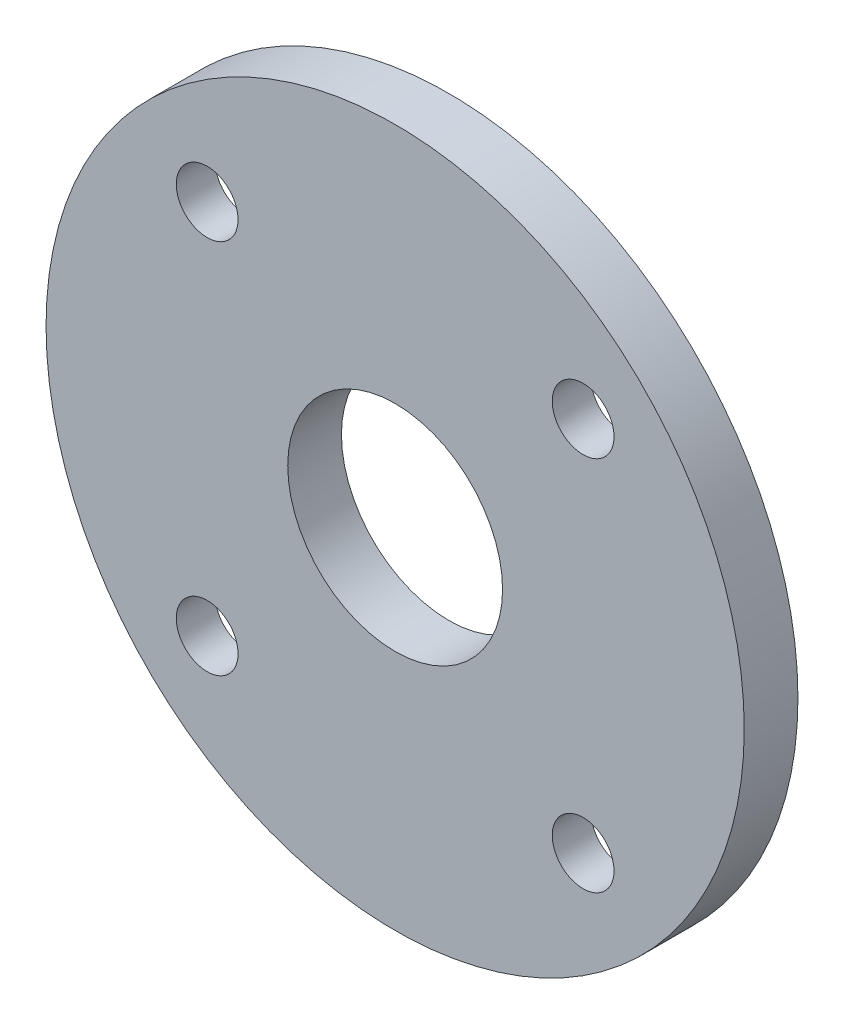
ISO-10303-21;
HEADER;
FILE_DESCRIPTION(('STEP AP214'),'2;1');
FILE_NAME('part.step','',(''),(''),'','','');
FILE_SCHEMA(('AUTOMOTIVE_DESIGN { 1 0 10303 214 1 1 1 1 }'));
ENDSEC;
DATA;
#1=APPLICATION_CONTEXT('core data for automotive mechanical design processes');
#2=APPLICATION_PROTOCOL_DEFINITION('international standard','automotive_design',2000,#1);
#3=PRODUCT_CONTEXT('',#1,'mechanical');
#4=PRODUCT('Part','Part','',(#3));
#5=PRODUCT_RELATED_PRODUCT_CATEGORY('part','',(#4));
#6=PRODUCT_DEFINITION_FORMATION('','',#4);
#7=PRODUCT_DEFINITION_CONTEXT('part definition',#1,'design');
#8=PRODUCT_DEFINITION('design','',#6,#7);
#9=PRODUCT_DEFINITION_SHAPE('','',#8);
#10=(LENGTH_UNIT() NAMED_UNIT(*) SI_UNIT(.MILLI.,.METRE.));
#11=(NAMED_UNIT(*) PLANE_ANGLE_UNIT() SI_UNIT($,.RADIAN.));
#12=(NAMED_UNIT(*) SI_UNIT($,.STERADIAN.) SOLID_ANGLE_UNIT());
#13=UNCERTAINTY_MEASURE_WITH_UNIT(LENGTH_MEASURE(1.E-05),#10,'distance_accuracy_value','');
#14=(GEOMETRIC_REPRESENTATION_CONTEXT(3) GLOBAL_UNCERTAINTY_ASSIGNED_CONTEXT((#13)) GLOBAL_UNIT_ASSIGNED_CONTEXT((#10,
#11,#12)) REPRESENTATION_CONTEXT('',''));
#15=CARTESIAN_POINT('',(0.,0.,0.));
#16=DIRECTION('',(0.,0.,1.));
#17=DIRECTION('',(1.,0.,0.));
#18=AXIS2_PLACEMENT_3D('',#15,#16,#17);
#19=CARTESIAN_POINT('',(0.,0.,2.));
#20=DIRECTION('',(0.,0.,1.));
#21=DIRECTION('',(1.,0.,0.));
#22=AXIS2_PLACEMENT_3D('',#19,#20,#21);
#23=PLANE('',#22);
#24=CARTESIAN_POINT('',(7.,-7.,2.));
#25=DIRECTION('',(0.,0.,1.));
#26=DIRECTION('',(1.,0.,0.));
#27=AXIS2_PLACEMENT_3D('',#24,#25,#26);
#28=CIRCLE('',#27,1.15);
#29=CARTESIAN_POINT('',(8.15,-7.,2.));
#30=VERTEX_POINT('',#29);
#31=EDGE_CURVE('E70',#30,#30,#28,.T.);
#32=ORIENTED_EDGE('',*,*,#31,.F.);
#33=EDGE_LOOP('',(#32));
#34=FACE_BOUND('',#33,.T.);
#35=CARTESIAN_POINT('',(-7.,-7.,2.));
#36=DIRECTION('',(0.,0.,1.));
#37=DIRECTION('',(1.,0.,0.));
#38=AXIS2_PLACEMENT_3D('',#35,#36,#37);
#39=CIRCLE('',#38,1.15);
#40=CARTESIAN_POINT('',(-5.85,-7.,2.));
#41=VERTEX_POINT('',#40);
#42=EDGE_CURVE('E73',#41,#41,#39,.T.);
#43=ORIENTED_EDGE('',*,*,#42,.F.);
#44=EDGE_LOOP('',(#43));
#45=FACE_BOUND('',#44,.T.);
#46=CARTESIAN_POINT('',(-7.,7.,2.));
#47=DIRECTION('',(0.,0.,1.));
#48=DIRECTION('',(1.,0.,0.));
#49=AXIS2_PLACEMENT_3D('',#46,#47,#48);
#50=CIRCLE('',#49,1.15);
#51=CARTESIAN_POINT('',(-5.85,7.,2.));
#52=VERTEX_POINT('',#51);
#53=EDGE_CURVE('E77',#52,#52,#50,.T.);
#54=ORIENTED_EDGE('',*,*,#53,.F.);
#55=EDGE_LOOP('',(#54));
#56=FACE_BOUND('',#55,.T.);
#57=CARTESIAN_POINT('',(7.,7.,2.));
#58=DIRECTION('',(0.,0.,1.));
#59=DIRECTION('',(1.,0.,0.));
#60=AXIS2_PLACEMENT_3D('',#57,#58,#59);
#61=CIRCLE('',#60,1.15);
#62=CARTESIAN_POINT('',(8.15,7.,2.));
#63=VERTEX_POINT('',#62);
#64=EDGE_CURVE('E78',#63,#63,#61,.T.);
#65=ORIENTED_EDGE('',*,*,#64,.F.);
#66=EDGE_LOOP('',(#65));
#67=FACE_BOUND('',#66,.T.);
#68=CARTESIAN_POINT('',(0.,0.,2.));
#69=DIRECTION('',(0.,0.,1.));
#70=DIRECTION('',(1.,0.,0.));
#71=AXIS2_PLACEMENT_3D('',#68,#69,#70);
#72=CIRCLE('',#71,13.);
#73=CARTESIAN_POINT('',(13.,0.,2.));
#74=VERTEX_POINT('',#73);
#75=EDGE_CURVE('E10',#74,#74,#72,.T.);
#76=ORIENTED_EDGE('',*,*,#75,.T.);
#77=EDGE_LOOP('',(#76));
#78=FACE_BOUND('',#77,.T.);
#79=CARTESIAN_POINT('',(0.,0.,2.));
#80=DIRECTION('',(0.,0.,1.));
#81=DIRECTION('',(1.,0.,0.));
#82=AXIS2_PLACEMENT_3D('',#79,#80,#81);
#83=CIRCLE('',#82,4.);
#84=CARTESIAN_POINT('',(4.,0.,2.));
#85=VERTEX_POINT('',#84);
#86=EDGE_CURVE('E49',#85,#85,#83,.T.);
#87=ORIENTED_EDGE('',*,*,#86,.F.);
#88=EDGE_LOOP('',(#87));
#89=FACE_BOUND('',#88,.T.);
#90=ADVANCED_FACE('F40',(#34,#45,#56,#67,#78,#89),#23,.T.);
#91=CARTESIAN_POINT('',(0.,0.,0.));
#92=DIRECTION('',(0.,0.,1.));
#93=DIRECTION('',(1.,0.,0.));
#94=AXIS2_PLACEMENT_3D('',#91,#92,#93);
#95=PLANE('',#94);
#96=CARTESIAN_POINT('',(7.,-7.,0.));
#97=DIRECTION('',(0.,0.,1.));
#98=DIRECTION('',(1.,0.,0.));
#99=AXIS2_PLACEMENT_3D('',#96,#97,#98);
#100=CIRCLE('',#99,2.1);
#101=CARTESIAN_POINT('',(9.1,-7.,0.));
#102=VERTEX_POINT('',#101);
#103=EDGE_CURVE('E126',#102,#102,#100,.T.);
#104=ORIENTED_EDGE('',*,*,#103,.T.);
#105=EDGE_LOOP('',(#104));
#106=FACE_BOUND('',#105,.T.);
#107=CARTESIAN_POINT('',(-7.,-7.,0.));
#108=DIRECTION('',(0.,0.,1.));
#109=DIRECTION('',(1.,0.,0.));
#110=AXIS2_PLACEMENT_3D('',#107,#108,#109);
#111=CIRCLE('',#110,2.1);
#112=CARTESIAN_POINT('',(-4.9,-7.,0.));
#113=VERTEX_POINT('',#112);
#114=EDGE_CURVE('E131',#113,#113,#111,.T.);
#115=ORIENTED_EDGE('',*,*,#114,.T.);
#116=EDGE_LOOP('',(#115));
#117=FACE_BOUND('',#116,.T.);
#118=CARTESIAN_POINT('',(-7.,7.,0.));
#119=DIRECTION('',(0.,0.,1.));
#120=DIRECTION('',(1.,0.,0.));
#121=AXIS2_PLACEMENT_3D('',#118,#119,#120);
#122=CIRCLE('',#121,2.1);
#123=CARTESIAN_POINT('',(-4.9,7.,0.));
#124=VERTEX_POINT('',#123);
#125=EDGE_CURVE('E124',#124,#124,#122,.T.);
#126=ORIENTED_EDGE('',*,*,#125,.T.);
#127=EDGE_LOOP('',(#126));
#128=FACE_BOUND('',#127,.T.);
#129=CARTESIAN_POINT('',(7.,7.,0.));
#130=DIRECTION('',(0.,0.,1.));
#131=DIRECTION('',(1.,0.,0.));
#132=AXIS2_PLACEMENT_3D('',#129,#130,#131);
#133=CIRCLE('',#132,2.1);
#134=CARTESIAN_POINT('',(9.1,7.,0.));
#135=VERTEX_POINT('',#134);
#136=EDGE_CURVE('E119',#135,#135,#133,.T.);
#137=ORIENTED_EDGE('',*,*,#136,.T.);
#138=EDGE_LOOP('',(#137));
#139=FACE_BOUND('',#138,.T.);
#140=CARTESIAN_POINT('',(0.,0.,0.));
#141=DIRECTION('',(0.,0.,1.));
#142=DIRECTION('',(1.,0.,0.));
#143=AXIS2_PLACEMENT_3D('',#140,#141,#142);
#144=CIRCLE('',#143,13.);
#145=CARTESIAN_POINT('',(13.,0.,0.));
#146=VERTEX_POINT('',#145);
#147=EDGE_CURVE('E44',#146,#146,#144,.T.);
#148=ORIENTED_EDGE('',*,*,#147,.F.);
#149=EDGE_LOOP('',(#148));
#150=FACE_BOUND('',#149,.T.);
#151=CARTESIAN_POINT('',(0.,0.,0.));
#152=DIRECTION('',(0.,0.,1.));
#153=DIRECTION('',(1.,0.,0.));
#154=AXIS2_PLACEMENT_3D('',#151,#152,#153);
#155=CIRCLE('',#154,4.);
#156=CARTESIAN_POINT('',(4.,0.,0.));
#157=VERTEX_POINT('',#156);
#158=EDGE_CURVE('E52',#157,#157,#155,.T.);
#159=ORIENTED_EDGE('',*,*,#158,.T.);
#160=EDGE_LOOP('',(#159));
#161=FACE_BOUND('',#160,.T.);
#162=ADVANCED_FACE('F88',(#106,#117,#128,#139,#150,#161),#95,.F.);
#163=CARTESIAN_POINT('',(0.,0.,2.));
#164=DIRECTION('',(0.,0.,-1.));
#165=DIRECTION('',(-1.,0.,0.));
#166=AXIS2_PLACEMENT_3D('',#163,#164,#165);
#167=CYLINDRICAL_SURFACE('',#166,13.);
#168=ORIENTED_EDGE('',*,*,#75,.F.);
#169=EDGE_LOOP('',(#168));
#170=FACE_BOUND('',#169,.T.);
#171=ORIENTED_EDGE('',*,*,#147,.T.);
#172=EDGE_LOOP('',(#171));
#173=FACE_BOUND('',#172,.T.);
#174=ADVANCED_FACE('F39',(#170,#173),#167,.T.);
#175=CARTESIAN_POINT('',(0.,0.,2.));
#176=DIRECTION('',(0.,0.,-1.));
#177=DIRECTION('',(-1.,0.,0.));
#178=AXIS2_PLACEMENT_3D('',#175,#176,#177);
#179=CYLINDRICAL_SURFACE('',#178,4.);
#180=ORIENTED_EDGE('',*,*,#86,.T.);
#181=EDGE_LOOP('',(#180));
#182=FACE_BOUND('',#181,.T.);
#183=ORIENTED_EDGE('',*,*,#158,.F.);
#184=EDGE_LOOP('',(#183));
#185=FACE_BOUND('',#184,.T.);
#186=ADVANCED_FACE('F86',(#182,#185),#179,.F.);
#187=CARTESIAN_POINT('',(7.,7.,2.));
#188=DIRECTION('',(0.,0.,-1.));
#189=DIRECTION('',(-1.,0.,0.));
#190=AXIS2_PLACEMENT_3D('',#187,#188,#189);
#191=CYLINDRICAL_SURFACE('',#190,1.15);
#192=CARTESIAN_POINT('',(7.,7.,0.55));
#193=DIRECTION('',(0.,0.,1.));
#194=DIRECTION('',(1.,0.,0.));
#195=AXIS2_PLACEMENT_3D('',#192,#193,#194);
#196=CIRCLE('',#195,1.15);
#197=CARTESIAN_POINT('',(8.15,7.,0.55));
#198=VERTEX_POINT('',#197);
#199=EDGE_CURVE('E41',#198,#198,#196,.T.);
#200=ORIENTED_EDGE('',*,*,#199,.F.);
#201=EDGE_LOOP('',(#200));
#202=FACE_BOUND('',#201,.T.);
#203=ORIENTED_EDGE('',*,*,#64,.T.);
#204=EDGE_LOOP('',(#203));
#205=FACE_BOUND('',#204,.T.);
#206=ADVANCED_FACE('F95',(#202,#205),#191,.F.);
#207=CARTESIAN_POINT('',(-7.,7.,2.));
#208=DIRECTION('',(0.,0.,-1.));
#209=DIRECTION('',(-1.,0.,0.));
#210=AXIS2_PLACEMENT_3D('',#207,#208,#209);
#211=CYLINDRICAL_SURFACE('',#210,1.15);
#212=CARTESIAN_POINT('',(-7.,7.,0.55));
#213=DIRECTION('',(0.,0.,1.));
#214=DIRECTION('',(1.,0.,0.));
#215=AXIS2_PLACEMENT_3D('',#212,#213,#214);
#216=CIRCLE('',#215,1.15);
#217=CARTESIAN_POINT('',(-5.85,7.,0.55));
#218=VERTEX_POINT('',#217);
#219=EDGE_CURVE('E65',#218,#218,#216,.T.);
#220=ORIENTED_EDGE('',*,*,#219,.F.);
#221=EDGE_LOOP('',(#220));
#222=FACE_BOUND('',#221,.T.);
#223=ORIENTED_EDGE('',*,*,#53,.T.);
#224=EDGE_LOOP('',(#223));
#225=FACE_BOUND('',#224,.T.);
#226=ADVANCED_FACE('F100',(#222,#225),#211,.F.);
#227=CARTESIAN_POINT('',(-7.,-7.,2.));
#228=DIRECTION('',(0.,0.,-1.));
#229=DIRECTION('',(-1.,0.,0.));
#230=AXIS2_PLACEMENT_3D('',#227,#228,#229);
#231=CYLINDRICAL_SURFACE('',#230,1.15);
#232=CARTESIAN_POINT('',(-7.,-7.,0.55));
#233=DIRECTION('',(0.,0.,1.));
#234=DIRECTION('',(1.,0.,0.));
#235=AXIS2_PLACEMENT_3D('',#232,#233,#234);
#236=CIRCLE('',#235,1.15);
#237=CARTESIAN_POINT('',(-5.85,-7.,0.55));
#238=VERTEX_POINT('',#237);
#239=EDGE_CURVE('E56',#238,#238,#236,.T.);
#240=ORIENTED_EDGE('',*,*,#239,.F.);
#241=EDGE_LOOP('',(#240));
#242=FACE_BOUND('',#241,.T.);
#243=ORIENTED_EDGE('',*,*,#42,.T.);
#244=EDGE_LOOP('',(#243));
#245=FACE_BOUND('',#244,.T.);
#246=ADVANCED_FACE('F185',(#242,#245),#231,.F.);
#247=CARTESIAN_POINT('',(7.,-7.,2.));
#248=DIRECTION('',(0.,0.,-1.));
#249=DIRECTION('',(-1.,0.,0.));
#250=AXIS2_PLACEMENT_3D('',#247,#248,#249);
#251=CYLINDRICAL_SURFACE('',#250,1.15);
#252=CARTESIAN_POINT('',(7.,-7.,0.55));
#253=DIRECTION('',(0.,0.,1.));
#254=DIRECTION('',(1.,0.,0.));
#255=AXIS2_PLACEMENT_3D('',#252,#253,#254);
#256=CIRCLE('',#255,1.15);
#257=CARTESIAN_POINT('',(8.15,-7.,0.55));
#258=VERTEX_POINT('',#257);
#259=EDGE_CURVE('E57',#258,#258,#256,.T.);
#260=ORIENTED_EDGE('',*,*,#259,.F.);
#261=EDGE_LOOP('',(#260));
#262=FACE_BOUND('',#261,.T.);
#263=ORIENTED_EDGE('',*,*,#31,.T.);
#264=EDGE_LOOP('',(#263));
#265=FACE_BOUND('',#264,.T.);
#266=ADVANCED_FACE('F169',(#262,#265),#251,.F.);
#267=CARTESIAN_POINT('',(7.,-7.,0.55));
#268=DIRECTION('',(0.,0.,-1.));
#269=DIRECTION('',(-1.,0.,0.));
#270=AXIS2_PLACEMENT_3D('',#267,#268,#269);
#271=CYLINDRICAL_SURFACE('',#270,2.1);
#272=CARTESIAN_POINT('',(7.,-7.,0.55));
#273=DIRECTION('',(0.,0.,1.));
#274=DIRECTION('',(1.,0.,0.));
#275=AXIS2_PLACEMENT_3D('',#272,#273,#274);
#276=CIRCLE('',#275,2.1);
#277=CARTESIAN_POINT('',(9.1,-7.,0.55));
#278=VERTEX_POINT('',#277);
#279=EDGE_CURVE('E127',#278,#278,#276,.T.);
#280=ORIENTED_EDGE('',*,*,#279,.T.);
#281=EDGE_LOOP('',(#280));
#282=FACE_BOUND('',#281,.T.);
#283=ORIENTED_EDGE('',*,*,#103,.F.);
#284=EDGE_LOOP('',(#283));
#285=FACE_BOUND('',#284,.T.);
#286=ADVANCED_FACE('F168',(#282,#285),#271,.F.);
#287=CARTESIAN_POINT('',(7.,-7.,0.55));
#288=DIRECTION('',(0.,0.,1.));
#289=DIRECTION('',(1.,0.,0.));
#290=AXIS2_PLACEMENT_3D('',#287,#288,#289);
#291=PLANE('',#290);
#292=ORIENTED_EDGE('',*,*,#259,.T.);
#293=EDGE_LOOP('',(#292));
#294=FACE_BOUND('',#293,.T.);
#295=ORIENTED_EDGE('',*,*,#279,.F.);
#296=EDGE_LOOP('',(#295));
#297=FACE_BOUND('',#296,.T.);
#298=ADVANCED_FACE('F161',(#294,#297),#291,.F.);
#299=CARTESIAN_POINT('',(-7.,-7.,0.55));
#300=DIRECTION('',(0.,0.,-1.));
#301=DIRECTION('',(-1.,0.,0.));
#302=AXIS2_PLACEMENT_3D('',#299,#300,#301);
#303=CYLINDRICAL_SURFACE('',#302,2.1);
#304=CARTESIAN_POINT('',(-7.,-7.,0.55));
#305=DIRECTION('',(0.,0.,1.));
#306=DIRECTION('',(1.,0.,0.));
#307=AXIS2_PLACEMENT_3D('',#304,#305,#306);
#308=CIRCLE('',#307,2.1);
#309=CARTESIAN_POINT('',(-4.9,-7.,0.55));
#310=VERTEX_POINT('',#309);
#311=EDGE_CURVE('E135',#310,#310,#308,.T.);
#312=ORIENTED_EDGE('',*,*,#311,.T.);
#313=EDGE_LOOP('',(#312));
#314=FACE_BOUND('',#313,.T.);
#315=ORIENTED_EDGE('',*,*,#114,.F.);
#316=EDGE_LOOP('',(#315));
#317=FACE_BOUND('',#316,.T.);
#318=ADVANCED_FACE('F156',(#314,#317),#303,.F.);
#319=CARTESIAN_POINT('',(-7.,-7.,0.55));
#320=DIRECTION('',(0.,0.,1.));
#321=DIRECTION('',(1.,0.,0.));
#322=AXIS2_PLACEMENT_3D('',#319,#320,#321);
#323=PLANE('',#322);
#324=ORIENTED_EDGE('',*,*,#239,.T.);
#325=EDGE_LOOP('',(#324));
#326=FACE_BOUND('',#325,.T.);
#327=ORIENTED_EDGE('',*,*,#311,.F.);
#328=EDGE_LOOP('',(#327));
#329=FACE_BOUND('',#328,.T.);
#330=ADVANCED_FACE('F146',(#326,#329),#323,.F.);
#331=CARTESIAN_POINT('',(-7.,7.,0.55));
#332=DIRECTION('',(0.,0.,-1.));
#333=DIRECTION('',(-1.,0.,0.));
#334=AXIS2_PLACEMENT_3D('',#331,#332,#333);
#335=CYLINDRICAL_SURFACE('',#334,2.1);
#336=CARTESIAN_POINT('',(-7.,7.,0.55));
#337=DIRECTION('',(0.,0.,1.));
#338=DIRECTION('',(1.,0.,0.));
#339=AXIS2_PLACEMENT_3D('',#336,#337,#338);
#340=CIRCLE('',#339,2.1);
#341=CARTESIAN_POINT('',(-4.9,7.,0.55));
#342=VERTEX_POINT('',#341);
#343=EDGE_CURVE('E136',#342,#342,#340,.T.);
#344=ORIENTED_EDGE('',*,*,#343,.T.);
#345=EDGE_LOOP('',(#344));
#346=FACE_BOUND('',#345,.T.);
#347=ORIENTED_EDGE('',*,*,#125,.F.);
#348=EDGE_LOOP('',(#347));
#349=FACE_BOUND('',#348,.T.);
#350=ADVANCED_FACE('F147',(#346,#349),#335,.F.);
#351=CARTESIAN_POINT('',(-7.,7.,0.55));
#352=DIRECTION('',(0.,0.,1.));
#353=DIRECTION('',(1.,0.,0.));
#354=AXIS2_PLACEMENT_3D('',#351,#352,#353);
#355=PLANE('',#354);
#356=ORIENTED_EDGE('',*,*,#219,.T.);
#357=EDGE_LOOP('',(#356));
#358=FACE_BOUND('',#357,.T.);
#359=ORIENTED_EDGE('',*,*,#343,.F.);
#360=EDGE_LOOP('',(#359));
#361=FACE_BOUND('',#360,.T.);
#362=ADVANCED_FACE('F149',(#358,#361),#355,.F.);
#363=CARTESIAN_POINT('',(7.,7.,0.55));
#364=DIRECTION('',(0.,0.,-1.));
#365=DIRECTION('',(-1.,0.,0.));
#366=AXIS2_PLACEMENT_3D('',#363,#364,#365);
#367=CYLINDRICAL_SURFACE('',#366,2.1);
#368=CARTESIAN_POINT('',(7.,7.,0.55));
#369=DIRECTION('',(0.,0.,1.));
#370=DIRECTION('',(1.,0.,0.));
#371=AXIS2_PLACEMENT_3D('',#368,#369,#370);
#372=CIRCLE('',#371,2.1);
#373=CARTESIAN_POINT('',(9.1,7.,0.55));
#374=VERTEX_POINT('',#373);
#375=EDGE_CURVE('E58',#374,#374,#372,.T.);
#376=ORIENTED_EDGE('',*,*,#375,.T.);
#377=EDGE_LOOP('',(#376));
#378=FACE_BOUND('',#377,.T.);
#379=ORIENTED_EDGE('',*,*,#136,.F.);
#380=EDGE_LOOP('',(#379));
#381=FACE_BOUND('',#380,.T.);
#382=ADVANCED_FACE('F158',(#378,#381),#367,.F.);
#383=CARTESIAN_POINT('',(7.,7.,0.55));
#384=DIRECTION('',(0.,0.,1.));
#385=DIRECTION('',(1.,0.,0.));
#386=AXIS2_PLACEMENT_3D('',#383,#384,#385);
#387=PLANE('',#386);
#388=ORIENTED_EDGE('',*,*,#199,.T.);
#389=EDGE_LOOP('',(#388));
#390=FACE_BOUND('',#389,.T.);
#391=ORIENTED_EDGE('',*,*,#375,.F.);
#392=EDGE_LOOP('',(#391));
#393=FACE_BOUND('',#392,.T.);
#394=ADVANCED_FACE('F172',(#390,#393),#387,.F.);
#395=CLOSED_SHELL('',(#90,#162,#174,#186,#206,#226,#246,#266,#286,#298,#318,#330,#350,#362,#382,#394));
#396=MANIFOLD_SOLID_BREP('B2',#395);
#397=ADVANCED_BREP_SHAPE_REPRESENTATION('',(#18,#396),#14);
#398=SHAPE_DEFINITION_REPRESENTATION(#9,#397);
ENDSEC;
END-ISO-10303-21;
